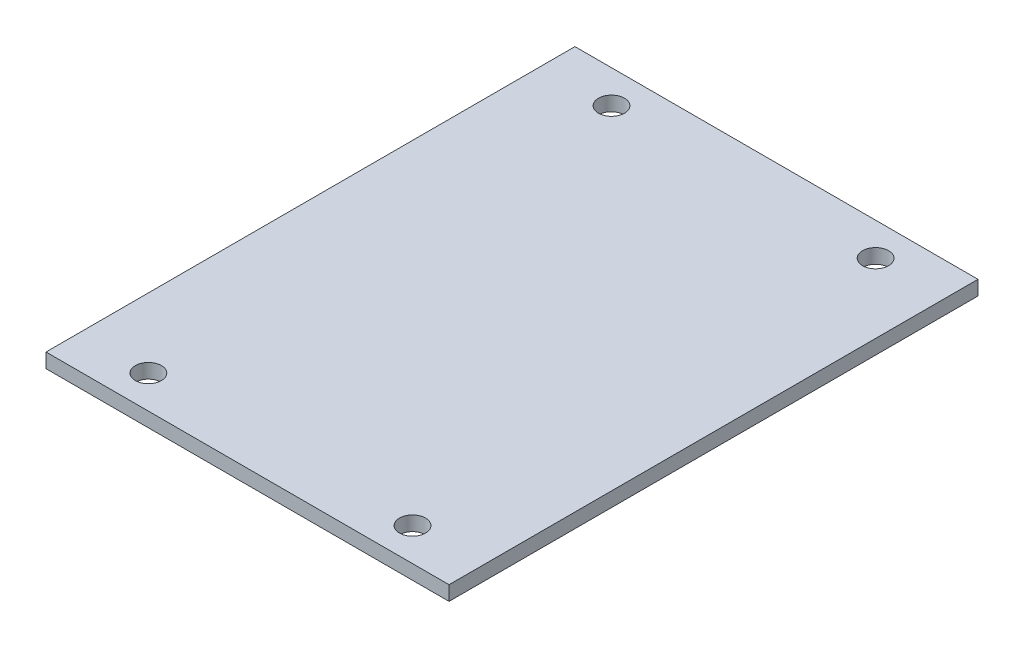
ISO-10303-21;
HEADER;
FILE_DESCRIPTION(('STEP AP214'),'2;1');
FILE_NAME('part.step','',(''),(''),'','','');
FILE_SCHEMA(('AUTOMOTIVE_DESIGN { 1 0 10303 214 1 1 1 1 }'));
ENDSEC;
DATA;
#1=APPLICATION_CONTEXT('core data for automotive mechanical design processes');
#2=APPLICATION_PROTOCOL_DEFINITION('international standard','automotive_design',2000,#1);
#3=PRODUCT_CONTEXT('',#1,'mechanical');
#4=PRODUCT('Part','Part','',(#3));
#5=PRODUCT_RELATED_PRODUCT_CATEGORY('part','',(#4));
#6=PRODUCT_DEFINITION_FORMATION('','',#4);
#7=PRODUCT_DEFINITION_CONTEXT('part definition',#1,'design');
#8=PRODUCT_DEFINITION('design','',#6,#7);
#9=PRODUCT_DEFINITION_SHAPE('','',#8);
#10=(LENGTH_UNIT() NAMED_UNIT(*) SI_UNIT(.MILLI.,.METRE.));
#11=(NAMED_UNIT(*) PLANE_ANGLE_UNIT() SI_UNIT($,.RADIAN.));
#12=(NAMED_UNIT(*) SI_UNIT($,.STERADIAN.) SOLID_ANGLE_UNIT());
#13=UNCERTAINTY_MEASURE_WITH_UNIT(LENGTH_MEASURE(1.E-05),#10,'distance_accuracy_value','');
#14=(GEOMETRIC_REPRESENTATION_CONTEXT(3) GLOBAL_UNCERTAINTY_ASSIGNED_CONTEXT((#13)) GLOBAL_UNIT_ASSIGNED_CONTEXT((#10,
#11,#12)) REPRESENTATION_CONTEXT('',''));
#15=CARTESIAN_POINT('',(0.,0.,0.));
#16=DIRECTION('',(0.,0.,1.));
#17=DIRECTION('',(1.,0.,0.));
#18=AXIS2_PLACEMENT_3D('',#15,#16,#17);
#19=CARTESIAN_POINT('',(-27.85,2.,-36.55));
#20=DIRECTION('',(1.,0.,0.));
#21=DIRECTION('',(0.,0.,-1.));
#22=AXIS2_PLACEMENT_3D('',#19,#20,#21);
#23=PLANE('',#22);
#24=DIRECTION('',(0.,0.,1.));
#25=VECTOR('',#24,1.);
#26=CARTESIAN_POINT('',(-27.85,0.,-36.55));
#27=LINE('',#26,#25);
#28=CARTESIAN_POINT('',(-27.85,0.,-36.55));
#29=VERTEX_POINT('',#28);
#30=CARTESIAN_POINT('',(-27.85,0.,36.55));
#31=VERTEX_POINT('',#30);
#32=EDGE_CURVE('E112',#29,#31,#27,.T.);
#33=ORIENTED_EDGE('',*,*,#32,.T.);
#34=DIRECTION('',(0.,-1.,0.));
#35=VECTOR('',#34,1.);
#36=CARTESIAN_POINT('',(-27.85,2.,36.55));
#37=LINE('',#36,#35);
#38=CARTESIAN_POINT('',(-27.85,2.,36.55));
#39=VERTEX_POINT('',#38);
#40=EDGE_CURVE('E11',#39,#31,#37,.T.);
#41=ORIENTED_EDGE('',*,*,#40,.F.);
#42=DIRECTION('',(0.,0.,1.));
#43=VECTOR('',#42,1.);
#44=CARTESIAN_POINT('',(-27.85,2.,-36.55));
#45=LINE('',#44,#43);
#46=CARTESIAN_POINT('',(-27.85,2.,-36.55));
#47=VERTEX_POINT('',#46);
#48=EDGE_CURVE('E96',#47,#39,#45,.T.);
#49=ORIENTED_EDGE('',*,*,#48,.F.);
#50=DIRECTION('',(0.,-1.,0.));
#51=VECTOR('',#50,1.);
#52=CARTESIAN_POINT('',(-27.85,2.,-36.55));
#53=LINE('',#52,#51);
#54=EDGE_CURVE('E108',#47,#29,#53,.T.);
#55=ORIENTED_EDGE('',*,*,#54,.T.);
#56=EDGE_LOOP('',(#33,#41,#49,#55));
#57=FACE_BOUND('',#56,.T.);
#58=ADVANCED_FACE('F44',(#57),#23,.F.);
#59=CARTESIAN_POINT('',(27.85,2.,36.55));
#60=DIRECTION('',(0.,0.,-1.));
#61=DIRECTION('',(-1.,0.,0.));
#62=AXIS2_PLACEMENT_3D('',#59,#60,#61);
#63=PLANE('',#62);
#64=DIRECTION('',(1.,0.,0.));
#65=VECTOR('',#64,1.);
#66=CARTESIAN_POINT('',(27.85,0.,36.55));
#67=LINE('',#66,#65);
#68=CARTESIAN_POINT('',(27.85,0.,36.55));
#69=VERTEX_POINT('',#68);
#70=EDGE_CURVE('E101',#31,#69,#67,.T.);
#71=ORIENTED_EDGE('',*,*,#70,.T.);
#72=DIRECTION('',(0.,-1.,0.));
#73=VECTOR('',#72,1.);
#74=CARTESIAN_POINT('',(27.85,2.,36.55));
#75=LINE('',#74,#73);
#76=CARTESIAN_POINT('',(27.85,2.,36.55));
#77=VERTEX_POINT('',#76);
#78=EDGE_CURVE('E53',#77,#69,#75,.T.);
#79=ORIENTED_EDGE('',*,*,#78,.F.);
#80=DIRECTION('',(1.,0.,0.));
#81=VECTOR('',#80,1.);
#82=CARTESIAN_POINT('',(27.85,2.,36.55));
#83=LINE('',#82,#81);
#84=EDGE_CURVE('E91',#39,#77,#83,.T.);
#85=ORIENTED_EDGE('',*,*,#84,.F.);
#86=ORIENTED_EDGE('',*,*,#40,.T.);
#87=EDGE_LOOP('',(#71,#79,#85,#86));
#88=FACE_BOUND('',#87,.T.);
#89=ADVANCED_FACE('F100',(#88),#63,.F.);
#90=CARTESIAN_POINT('',(27.85,2.,-36.55));
#91=DIRECTION('',(-1.,0.,0.));
#92=DIRECTION('',(0.,0.,1.));
#93=AXIS2_PLACEMENT_3D('',#90,#91,#92);
#94=PLANE('',#93);
#95=DIRECTION('',(0.,0.,-1.));
#96=VECTOR('',#95,1.);
#97=CARTESIAN_POINT('',(27.85,0.,-36.55));
#98=LINE('',#97,#96);
#99=CARTESIAN_POINT('',(27.85,0.,-36.55));
#100=VERTEX_POINT('',#99);
#101=EDGE_CURVE('E78',#69,#100,#98,.T.);
#102=ORIENTED_EDGE('',*,*,#101,.T.);
#103=DIRECTION('',(0.,-1.,0.));
#104=VECTOR('',#103,1.);
#105=CARTESIAN_POINT('',(27.85,2.,-36.55));
#106=LINE('',#105,#104);
#107=CARTESIAN_POINT('',(27.85,2.,-36.55));
#108=VERTEX_POINT('',#107);
#109=EDGE_CURVE('E103',#108,#100,#106,.T.);
#110=ORIENTED_EDGE('',*,*,#109,.F.);
#111=DIRECTION('',(0.,0.,-1.));
#112=VECTOR('',#111,1.);
#113=CARTESIAN_POINT('',(27.85,2.,-36.55));
#114=LINE('',#113,#112);
#115=EDGE_CURVE('E94',#77,#108,#114,.T.);
#116=ORIENTED_EDGE('',*,*,#115,.F.);
#117=ORIENTED_EDGE('',*,*,#78,.T.);
#118=EDGE_LOOP('',(#102,#110,#116,#117));
#119=FACE_BOUND('',#118,.T.);
#120=ADVANCED_FACE('F104',(#119),#94,.F.);
#121=CARTESIAN_POINT('',(27.85,2.,-36.55));
#122=DIRECTION('',(0.,0.,1.));
#123=DIRECTION('',(1.,0.,0.));
#124=AXIS2_PLACEMENT_3D('',#121,#122,#123);
#125=PLANE('',#124);
#126=DIRECTION('',(-1.,0.,0.));
#127=VECTOR('',#126,1.);
#128=CARTESIAN_POINT('',(27.85,0.,-36.55));
#129=LINE('',#128,#127);
#130=EDGE_CURVE('E84',#100,#29,#129,.T.);
#131=ORIENTED_EDGE('',*,*,#130,.T.);
#132=ORIENTED_EDGE('',*,*,#54,.F.);
#133=DIRECTION('',(-1.,0.,0.));
#134=VECTOR('',#133,1.);
#135=CARTESIAN_POINT('',(27.85,2.,-36.55));
#136=LINE('',#135,#134);
#137=EDGE_CURVE('E61',#108,#47,#136,.T.);
#138=ORIENTED_EDGE('',*,*,#137,.F.);
#139=ORIENTED_EDGE('',*,*,#109,.T.);
#140=EDGE_LOOP('',(#131,#132,#138,#139));
#141=FACE_BOUND('',#140,.T.);
#142=ADVANCED_FACE('F126',(#141),#125,.F.);
#143=CARTESIAN_POINT('',(0.,2.,0.));
#144=DIRECTION('',(0.,-1.,0.));
#145=DIRECTION('',(0.,0.,-1.));
#146=AXIS2_PLACEMENT_3D('',#143,#144,#145);
#147=PLANE('',#146);
#148=CARTESIAN_POINT('',(18.25,2.,-32.));
#149=DIRECTION('',(0.,1.,0.));
#150=DIRECTION('',(0.,0.,1.));
#151=AXIS2_PLACEMENT_3D('',#148,#149,#150);
#152=CIRCLE('',#151,1.8);
#153=CARTESIAN_POINT('',(18.25,2.,-30.2));
#154=VERTEX_POINT('',#153);
#155=EDGE_CURVE('E137',#154,#154,#152,.T.);
#156=ORIENTED_EDGE('',*,*,#155,.F.);
#157=EDGE_LOOP('',(#156));
#158=FACE_BOUND('',#157,.T.);
#159=CARTESIAN_POINT('',(-18.25,2.,32.));
#160=DIRECTION('',(0.,1.,0.));
#161=DIRECTION('',(0.,0.,1.));
#162=AXIS2_PLACEMENT_3D('',#159,#160,#161);
#163=CIRCLE('',#162,1.8);
#164=CARTESIAN_POINT('',(-18.25,2.,33.8));
#165=VERTEX_POINT('',#164);
#166=EDGE_CURVE('E145',#165,#165,#163,.T.);
#167=ORIENTED_EDGE('',*,*,#166,.F.);
#168=EDGE_LOOP('',(#167));
#169=FACE_BOUND('',#168,.T.);
#170=CARTESIAN_POINT('',(18.25,2.,32.));
#171=DIRECTION('',(0.,1.,0.));
#172=DIRECTION('',(0.,0.,1.));
#173=AXIS2_PLACEMENT_3D('',#170,#171,#172);
#174=CIRCLE('',#173,1.8);
#175=CARTESIAN_POINT('',(18.25,2.,33.8));
#176=VERTEX_POINT('',#175);
#177=EDGE_CURVE('E146',#176,#176,#174,.T.);
#178=ORIENTED_EDGE('',*,*,#177,.F.);
#179=EDGE_LOOP('',(#178));
#180=FACE_BOUND('',#179,.T.);
#181=CARTESIAN_POINT('',(-18.25,2.,-32.));
#182=DIRECTION('',(0.,1.,0.));
#183=DIRECTION('',(0.,0.,1.));
#184=AXIS2_PLACEMENT_3D('',#181,#182,#183);
#185=CIRCLE('',#184,1.8);
#186=CARTESIAN_POINT('',(-18.25,2.,-30.2));
#187=VERTEX_POINT('',#186);
#188=EDGE_CURVE('E133',#187,#187,#185,.T.);
#189=ORIENTED_EDGE('',*,*,#188,.F.);
#190=EDGE_LOOP('',(#189));
#191=FACE_BOUND('',#190,.T.);
#192=ORIENTED_EDGE('',*,*,#48,.T.);
#193=ORIENTED_EDGE('',*,*,#84,.T.);
#194=ORIENTED_EDGE('',*,*,#115,.T.);
#195=ORIENTED_EDGE('',*,*,#137,.T.);
#196=EDGE_LOOP('',(#192,#193,#194,#195));
#197=FACE_BOUND('',#196,.T.);
#198=ADVANCED_FACE('F92',(#158,#169,#180,#191,#197),#147,.F.);
#199=CARTESIAN_POINT('',(0.,0.,0.));
#200=DIRECTION('',(0.,-1.,0.));
#201=DIRECTION('',(0.,0.,-1.));
#202=AXIS2_PLACEMENT_3D('',#199,#200,#201);
#203=PLANE('',#202);
#204=CARTESIAN_POINT('',(18.25,0.,-32.));
#205=DIRECTION('',(0.,1.,0.));
#206=DIRECTION('',(0.,0.,1.));
#207=AXIS2_PLACEMENT_3D('',#204,#205,#206);
#208=CIRCLE('',#207,1.8);
#209=CARTESIAN_POINT('',(18.25,0.,-30.2));
#210=VERTEX_POINT('',#209);
#211=EDGE_CURVE('E150',#210,#210,#208,.T.);
#212=ORIENTED_EDGE('',*,*,#211,.T.);
#213=EDGE_LOOP('',(#212));
#214=FACE_BOUND('',#213,.T.);
#215=CARTESIAN_POINT('',(-18.25,0.,32.));
#216=DIRECTION('',(0.,1.,0.));
#217=DIRECTION('',(0.,0.,1.));
#218=AXIS2_PLACEMENT_3D('',#215,#216,#217);
#219=CIRCLE('',#218,1.8);
#220=CARTESIAN_POINT('',(-18.25,0.,33.8));
#221=VERTEX_POINT('',#220);
#222=EDGE_CURVE('E141',#221,#221,#219,.T.);
#223=ORIENTED_EDGE('',*,*,#222,.T.);
#224=EDGE_LOOP('',(#223));
#225=FACE_BOUND('',#224,.T.);
#226=CARTESIAN_POINT('',(18.25,0.,32.));
#227=DIRECTION('',(0.,1.,0.));
#228=DIRECTION('',(0.,0.,1.));
#229=AXIS2_PLACEMENT_3D('',#226,#227,#228);
#230=CIRCLE('',#229,1.8);
#231=CARTESIAN_POINT('',(18.25,0.,33.8));
#232=VERTEX_POINT('',#231);
#233=EDGE_CURVE('E157',#232,#232,#230,.T.);
#234=ORIENTED_EDGE('',*,*,#233,.T.);
#235=EDGE_LOOP('',(#234));
#236=FACE_BOUND('',#235,.T.);
#237=CARTESIAN_POINT('',(-18.25,0.,-32.));
#238=DIRECTION('',(0.,1.,0.));
#239=DIRECTION('',(0.,0.,1.));
#240=AXIS2_PLACEMENT_3D('',#237,#238,#239);
#241=CIRCLE('',#240,1.8);
#242=CARTESIAN_POINT('',(-18.25,0.,-30.2));
#243=VERTEX_POINT('',#242);
#244=EDGE_CURVE('E116',#243,#243,#241,.T.);
#245=ORIENTED_EDGE('',*,*,#244,.T.);
#246=EDGE_LOOP('',(#245));
#247=FACE_BOUND('',#246,.T.);
#248=ORIENTED_EDGE('',*,*,#32,.F.);
#249=ORIENTED_EDGE('',*,*,#130,.F.);
#250=ORIENTED_EDGE('',*,*,#101,.F.);
#251=ORIENTED_EDGE('',*,*,#70,.F.);
#252=EDGE_LOOP('',(#248,#249,#250,#251));
#253=FACE_BOUND('',#252,.T.);
#254=ADVANCED_FACE('F129',(#214,#225,#236,#247,#253),#203,.T.);
#255=CARTESIAN_POINT('',(-18.25,0.,-32.));
#256=DIRECTION('',(0.,1.,0.));
#257=DIRECTION('',(0.,0.,1.));
#258=AXIS2_PLACEMENT_3D('',#255,#256,#257);
#259=CYLINDRICAL_SURFACE('',#258,1.8);
#260=ORIENTED_EDGE('',*,*,#244,.F.);
#261=EDGE_LOOP('',(#260));
#262=FACE_BOUND('',#261,.T.);
#263=ORIENTED_EDGE('',*,*,#188,.T.);
#264=EDGE_LOOP('',(#263));
#265=FACE_BOUND('',#264,.T.);
#266=ADVANCED_FACE('F173',(#262,#265),#259,.F.);
#267=CARTESIAN_POINT('',(18.25,0.,32.));
#268=DIRECTION('',(0.,1.,0.));
#269=DIRECTION('',(0.,0.,1.));
#270=AXIS2_PLACEMENT_3D('',#267,#268,#269);
#271=CYLINDRICAL_SURFACE('',#270,1.8);
#272=ORIENTED_EDGE('',*,*,#233,.F.);
#273=EDGE_LOOP('',(#272));
#274=FACE_BOUND('',#273,.T.);
#275=ORIENTED_EDGE('',*,*,#177,.T.);
#276=EDGE_LOOP('',(#275));
#277=FACE_BOUND('',#276,.T.);
#278=ADVANCED_FACE('F165',(#274,#277),#271,.F.);
#279=CARTESIAN_POINT('',(-18.25,0.,32.));
#280=DIRECTION('',(0.,1.,0.));
#281=DIRECTION('',(0.,0.,1.));
#282=AXIS2_PLACEMENT_3D('',#279,#280,#281);
#283=CYLINDRICAL_SURFACE('',#282,1.8);
#284=ORIENTED_EDGE('',*,*,#222,.F.);
#285=EDGE_LOOP('',(#284));
#286=FACE_BOUND('',#285,.T.);
#287=ORIENTED_EDGE('',*,*,#166,.T.);
#288=EDGE_LOOP('',(#287));
#289=FACE_BOUND('',#288,.T.);
#290=ADVANCED_FACE('F181',(#286,#289),#283,.F.);
#291=CARTESIAN_POINT('',(18.25,0.,-32.));
#292=DIRECTION('',(0.,1.,0.));
#293=DIRECTION('',(0.,0.,1.));
#294=AXIS2_PLACEMENT_3D('',#291,#292,#293);
#295=CYLINDRICAL_SURFACE('',#294,1.8);
#296=ORIENTED_EDGE('',*,*,#211,.F.);
#297=EDGE_LOOP('',(#296));
#298=FACE_BOUND('',#297,.T.);
#299=ORIENTED_EDGE('',*,*,#155,.T.);
#300=EDGE_LOOP('',(#299));
#301=FACE_BOUND('',#300,.T.);
#302=ADVANCED_FACE('F232',(#298,#301),#295,.F.);
#303=CLOSED_SHELL('',(#58,#89,#120,#142,#198,#254,#266,#278,#290,#302));
#304=MANIFOLD_SOLID_BREP('B2',#303);
#305=ADVANCED_BREP_SHAPE_REPRESENTATION('',(#18,#304),#14);
#306=SHAPE_DEFINITION_REPRESENTATION(#9,#305);
ENDSEC;
END-ISO-10303-21;
